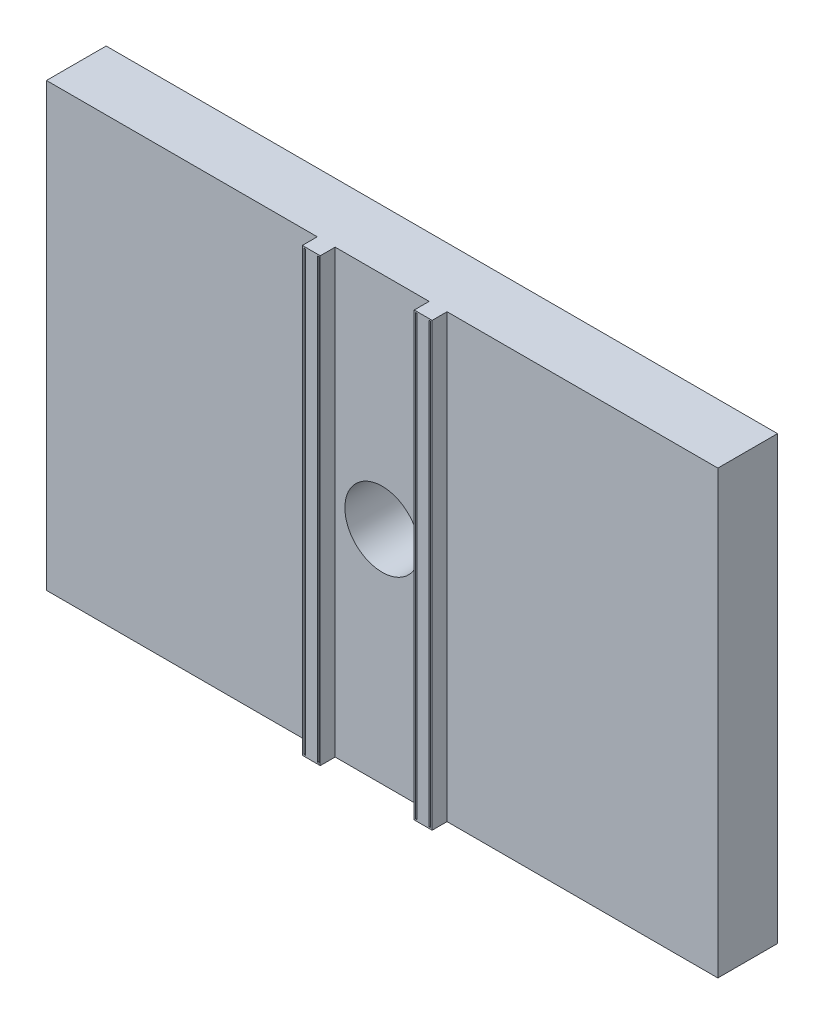
ISO-10303-21;
HEADER;
FILE_DESCRIPTION(('STEP AP214'),'2;1');
FILE_NAME('part.step','',(''),(''),'','','');
FILE_SCHEMA(('AUTOMOTIVE_DESIGN { 1 0 10303 214 1 1 1 1 }'));
ENDSEC;
DATA;
#1=APPLICATION_CONTEXT('core data for automotive mechanical design processes');
#2=APPLICATION_PROTOCOL_DEFINITION('international standard','automotive_design',2000,#1);
#3=PRODUCT_CONTEXT('',#1,'mechanical');
#4=PRODUCT('Part','Part','',(#3));
#5=PRODUCT_RELATED_PRODUCT_CATEGORY('part','',(#4));
#6=PRODUCT_DEFINITION_FORMATION('','',#4);
#7=PRODUCT_DEFINITION_CONTEXT('part definition',#1,'design');
#8=PRODUCT_DEFINITION('design','',#6,#7);
#9=PRODUCT_DEFINITION_SHAPE('','',#8);
#10=(LENGTH_UNIT() NAMED_UNIT(*) SI_UNIT(.MILLI.,.METRE.));
#11=(NAMED_UNIT(*) PLANE_ANGLE_UNIT() SI_UNIT($,.RADIAN.));
#12=(NAMED_UNIT(*) SI_UNIT($,.STERADIAN.) SOLID_ANGLE_UNIT());
#13=UNCERTAINTY_MEASURE_WITH_UNIT(LENGTH_MEASURE(1.E-05),#10,'distance_accuracy_value','');
#14=(GEOMETRIC_REPRESENTATION_CONTEXT(3) GLOBAL_UNCERTAINTY_ASSIGNED_CONTEXT((#13)) GLOBAL_UNIT_ASSIGNED_CONTEXT((#10,
#11,#12)) REPRESENTATION_CONTEXT('',''));
#15=CARTESIAN_POINT('',(0.,0.,0.));
#16=DIRECTION('',(0.,0.,1.));
#17=DIRECTION('',(1.,0.,0.));
#18=AXIS2_PLACEMENT_3D('',#15,#16,#17);
#19=CARTESIAN_POINT('',(0.,0.,10.16));
#20=DIRECTION('',(0.,0.,1.));
#21=DIRECTION('',(1.,0.,0.));
#22=AXIS2_PLACEMENT_3D('',#19,#20,#21);
#23=PLANE('',#22);
#24=DIRECTION('',(0.,1.,0.));
#25=VECTOR('',#24,1.);
#26=CARTESIAN_POINT('',(-36.35375,37.592,10.16));
#27=LINE('',#26,#25);
#28=CARTESIAN_POINT('',(-36.35375,-37.338,10.16));
#29=VERTEX_POINT('',#28);
#30=CARTESIAN_POINT('',(-36.35375,37.338,10.16));
#31=VERTEX_POINT('',#30);
#32=EDGE_CURVE('E361',#29,#31,#27,.T.);
#33=ORIENTED_EDGE('',*,*,#32,.T.);
#34=DIRECTION('',(1.,0.,0.));
#35=VECTOR('',#34,1.);
#36=CARTESIAN_POINT('',(-39.14775,37.338,10.16));
#37=LINE('',#36,#35);
#38=CARTESIAN_POINT('',(-36.60775,37.338,10.16));
#39=VERTEX_POINT('',#38);
#40=EDGE_CURVE('E324',#39,#31,#37,.T.);
#41=ORIENTED_EDGE('',*,*,#40,.F.);
#42=DIRECTION('',(0.,-1.,0.));
#43=VECTOR('',#42,1.);
#44=CARTESIAN_POINT('',(-36.60775,37.592,10.16));
#45=LINE('',#44,#43);
#46=CARTESIAN_POINT('',(-36.60775,-37.338,10.16));
#47=VERTEX_POINT('',#46);
#48=EDGE_CURVE('E339',#39,#47,#45,.T.);
#49=ORIENTED_EDGE('',*,*,#48,.T.);
#50=DIRECTION('',(1.,0.,0.));
#51=VECTOR('',#50,1.);
#52=CARTESIAN_POINT('',(-39.14775,-37.338,10.16));
#53=LINE('',#52,#51);
#54=EDGE_CURVE('E247',#47,#29,#53,.T.);
#55=ORIENTED_EDGE('',*,*,#54,.T.);
#56=EDGE_LOOP('',(#33,#41,#49,#55));
#57=FACE_BOUND('',#56,.T.);
#58=ADVANCED_FACE('F35',(#57),#23,.T.);
#59=DIRECTION('',(0.,1.,0.));
#60=VECTOR('',#59,1.);
#61=CARTESIAN_POINT('',(-38.63975,37.592,10.16));
#62=LINE('',#61,#60);
#63=CARTESIAN_POINT('',(-38.63975,-37.338,10.16));
#64=VERTEX_POINT('',#63);
#65=CARTESIAN_POINT('',(-38.63975,37.338,10.16));
#66=VERTEX_POINT('',#65);
#67=EDGE_CURVE('E233',#64,#66,#62,.T.);
#68=ORIENTED_EDGE('',*,*,#67,.T.);
#69=CARTESIAN_POINT('',(-38.89375,37.338,10.16));
#70=VERTEX_POINT('',#69);
#71=EDGE_CURVE('E50',#70,#66,#37,.T.);
#72=ORIENTED_EDGE('',*,*,#71,.F.);
#73=DIRECTION('',(0.,-1.,0.));
#74=VECTOR('',#73,1.);
#75=CARTESIAN_POINT('',(-38.89375,37.592,10.16));
#76=LINE('',#75,#74);
#77=CARTESIAN_POINT('',(-38.89375,-37.338,10.16));
#78=VERTEX_POINT('',#77);
#79=EDGE_CURVE('E343',#70,#78,#76,.T.);
#80=ORIENTED_EDGE('',*,*,#79,.T.);
#81=EDGE_CURVE('E255',#78,#64,#53,.T.);
#82=ORIENTED_EDGE('',*,*,#81,.T.);
#83=EDGE_LOOP('',(#68,#72,#80,#82));
#84=FACE_BOUND('',#83,.T.);
#85=ADVANCED_FACE('F525',(#84),#23,.T.);
#86=CARTESIAN_POINT('',(-36.35375,37.592,12.7));
#87=DIRECTION('',(-1.,0.,0.));
#88=DIRECTION('',(0.,-1.,0.));
#89=AXIS2_PLACEMENT_3D('',#86,#87,#88);
#90=PLANE('',#89);
#91=DIRECTION('',(0.,1.,0.));
#92=VECTOR('',#91,1.);
#93=CARTESIAN_POINT('',(-36.35375,37.592,12.7));
#94=LINE('',#93,#92);
#95=CARTESIAN_POINT('',(-36.35375,-37.338,12.7));
#96=VERTEX_POINT('',#95);
#97=CARTESIAN_POINT('',(-36.35375,37.338,12.7));
#98=VERTEX_POINT('',#97);
#99=EDGE_CURVE('E239',#96,#98,#94,.T.);
#100=ORIENTED_EDGE('',*,*,#99,.T.);
#101=DIRECTION('',(0.,0.,-1.));
#102=VECTOR('',#101,1.);
#103=CARTESIAN_POINT('',(-36.35375,37.338,12.7));
#104=LINE('',#103,#102);
#105=EDGE_CURVE('E332',#98,#31,#104,.T.);
#106=ORIENTED_EDGE('',*,*,#105,.T.);
#107=ORIENTED_EDGE('',*,*,#32,.F.);
#108=DIRECTION('',(0.,0.,-1.));
#109=VECTOR('',#108,1.);
#110=CARTESIAN_POINT('',(-36.35375,-37.338,12.7));
#111=LINE('',#110,#109);
#112=EDGE_CURVE('E252',#96,#29,#111,.T.);
#113=ORIENTED_EDGE('',*,*,#112,.F.);
#114=EDGE_LOOP('',(#100,#106,#107,#113));
#115=FACE_BOUND('',#114,.T.);
#116=ADVANCED_FACE('F531',(#115),#90,.T.);
#117=CARTESIAN_POINT('',(-38.89375,37.592,12.7));
#118=DIRECTION('',(1.,0.,0.));
#119=DIRECTION('',(0.,1.,0.));
#120=AXIS2_PLACEMENT_3D('',#117,#118,#119);
#121=PLANE('',#120);
#122=ORIENTED_EDGE('',*,*,#79,.F.);
#123=DIRECTION('',(0.,0.,1.));
#124=VECTOR('',#123,1.);
#125=CARTESIAN_POINT('',(-38.89375,37.338,12.7));
#126=LINE('',#125,#124);
#127=CARTESIAN_POINT('',(-38.89375,37.338,12.7));
#128=VERTEX_POINT('',#127);
#129=EDGE_CURVE('E57',#70,#128,#126,.T.);
#130=ORIENTED_EDGE('',*,*,#129,.T.);
#131=DIRECTION('',(0.,-1.,0.));
#132=VECTOR('',#131,1.);
#133=CARTESIAN_POINT('',(-38.89375,37.592,12.7));
#134=LINE('',#133,#132);
#135=CARTESIAN_POINT('',(-38.89375,-37.338,12.7));
#136=VERTEX_POINT('',#135);
#137=EDGE_CURVE('E346',#128,#136,#134,.T.);
#138=ORIENTED_EDGE('',*,*,#137,.T.);
#139=DIRECTION('',(0.,0.,1.));
#140=VECTOR('',#139,1.);
#141=CARTESIAN_POINT('',(-38.89375,-37.338,12.7));
#142=LINE('',#141,#140);
#143=EDGE_CURVE('E248',#78,#136,#142,.T.);
#144=ORIENTED_EDGE('',*,*,#143,.F.);
#145=EDGE_LOOP('',(#122,#130,#138,#144));
#146=FACE_BOUND('',#145,.T.);
#147=ADVANCED_FACE('F617',(#146),#121,.T.);
#148=CARTESIAN_POINT('',(-36.60775,37.592,12.7));
#149=DIRECTION('',(1.,0.,0.));
#150=DIRECTION('',(0.,1.,0.));
#151=AXIS2_PLACEMENT_3D('',#148,#149,#150);
#152=PLANE('',#151);
#153=ORIENTED_EDGE('',*,*,#48,.F.);
#154=DIRECTION('',(0.,0.,1.));
#155=VECTOR('',#154,1.);
#156=CARTESIAN_POINT('',(-36.60775,37.338,12.7));
#157=LINE('',#156,#155);
#158=CARTESIAN_POINT('',(-36.60775,37.338,12.7));
#159=VERTEX_POINT('',#158);
#160=EDGE_CURVE('E229',#39,#159,#157,.T.);
#161=ORIENTED_EDGE('',*,*,#160,.T.);
#162=DIRECTION('',(0.,-1.,0.));
#163=VECTOR('',#162,1.);
#164=CARTESIAN_POINT('',(-36.60775,37.592,12.7));
#165=LINE('',#164,#163);
#166=CARTESIAN_POINT('',(-36.60775,-37.338,12.7));
#167=VERTEX_POINT('',#166);
#168=EDGE_CURVE('E222',#159,#167,#165,.T.);
#169=ORIENTED_EDGE('',*,*,#168,.T.);
#170=DIRECTION('',(0.,0.,1.));
#171=VECTOR('',#170,1.);
#172=CARTESIAN_POINT('',(-36.60775,-37.338,12.7));
#173=LINE('',#172,#171);
#174=EDGE_CURVE('E227',#47,#167,#173,.T.);
#175=ORIENTED_EDGE('',*,*,#174,.F.);
#176=EDGE_LOOP('',(#153,#161,#169,#175));
#177=FACE_BOUND('',#176,.T.);
#178=ADVANCED_FACE('F225',(#177),#152,.T.);
#179=CARTESIAN_POINT('',(-38.63975,37.592,12.7));
#180=DIRECTION('',(-1.,0.,0.));
#181=DIRECTION('',(0.,-1.,0.));
#182=AXIS2_PLACEMENT_3D('',#179,#180,#181);
#183=PLANE('',#182);
#184=DIRECTION('',(0.,1.,0.));
#185=VECTOR('',#184,1.);
#186=CARTESIAN_POINT('',(-38.63975,37.592,12.7));
#187=LINE('',#186,#185);
#188=CARTESIAN_POINT('',(-38.63975,-37.338,12.7));
#189=VERTEX_POINT('',#188);
#190=CARTESIAN_POINT('',(-38.63975,37.338,12.7));
#191=VERTEX_POINT('',#190);
#192=EDGE_CURVE('E232',#189,#191,#187,.T.);
#193=ORIENTED_EDGE('',*,*,#192,.T.);
#194=DIRECTION('',(0.,0.,-1.));
#195=VECTOR('',#194,1.);
#196=CARTESIAN_POINT('',(-38.63975,37.338,12.7));
#197=LINE('',#196,#195);
#198=EDGE_CURVE('E328',#191,#66,#197,.T.);
#199=ORIENTED_EDGE('',*,*,#198,.T.);
#200=ORIENTED_EDGE('',*,*,#67,.F.);
#201=DIRECTION('',(0.,0.,-1.));
#202=VECTOR('',#201,1.);
#203=CARTESIAN_POINT('',(-38.63975,-37.338,12.7));
#204=LINE('',#203,#202);
#205=EDGE_CURVE('E249',#189,#64,#204,.T.);
#206=ORIENTED_EDGE('',*,*,#205,.F.);
#207=EDGE_LOOP('',(#193,#199,#200,#206));
#208=FACE_BOUND('',#207,.T.);
#209=ADVANCED_FACE('F611',(#208),#183,.T.);
#210=DIRECTION('',(0.,-1.,0.));
#211=VECTOR('',#210,1.);
#212=CARTESIAN_POINT('',(-36.09975,37.592,10.16));
#213=LINE('',#212,#211);
#214=CARTESIAN_POINT('',(-36.09975,37.592,10.16));
#215=VERTEX_POINT('',#214);
#216=CARTESIAN_POINT('',(-36.09975,-37.592,10.16));
#217=VERTEX_POINT('',#216);
#218=EDGE_CURVE('E357',#215,#217,#213,.T.);
#219=ORIENTED_EDGE('',*,*,#218,.T.);
#220=DIRECTION('',(-1.,0.,0.));
#221=VECTOR('',#220,1.);
#222=CARTESIAN_POINT('',(-28.09875,-37.592,10.16));
#223=LINE('',#222,#221);
#224=CARTESIAN_POINT('',(-20.09775,-37.592,10.16));
#225=VERTEX_POINT('',#224);
#226=EDGE_CURVE('E317',#225,#217,#223,.T.);
#227=ORIENTED_EDGE('',*,*,#226,.F.);
#228=DIRECTION('',(0.,-1.,0.));
#229=VECTOR('',#228,1.);
#230=CARTESIAN_POINT('',(-20.09775,37.592,10.16));
#231=LINE('',#230,#229);
#232=CARTESIAN_POINT('',(-20.09775,37.592,10.16));
#233=VERTEX_POINT('',#232);
#234=EDGE_CURVE('E429',#233,#225,#231,.T.);
#235=ORIENTED_EDGE('',*,*,#234,.F.);
#236=DIRECTION('',(-1.,0.,0.));
#237=VECTOR('',#236,1.);
#238=CARTESIAN_POINT('',(-28.09875,37.592,10.16));
#239=LINE('',#238,#237);
#240=EDGE_CURVE('E452',#233,#215,#239,.T.);
#241=ORIENTED_EDGE('',*,*,#240,.T.);
#242=EDGE_LOOP('',(#219,#227,#235,#241));
#243=FACE_BOUND('',#242,.T.);
#244=CARTESIAN_POINT('',(-28.09875,0.,10.16));
#245=DIRECTION('',(0.,0.,1.));
#246=DIRECTION('',(1.,0.,0.));
#247=AXIS2_PLACEMENT_3D('',#244,#245,#246);
#248=CIRCLE('',#247,6.35);
#249=CARTESIAN_POINT('',(-21.74875,0.,10.16));
#250=VERTEX_POINT('',#249);
#251=EDGE_CURVE('E402',#250,#250,#248,.T.);
#252=ORIENTED_EDGE('',*,*,#251,.F.);
#253=EDGE_LOOP('',(#252));
#254=FACE_BOUND('',#253,.T.);
#255=ADVANCED_FACE('F483',(#243,#254),#23,.T.);
#256=CARTESIAN_POINT('',(0.,0.,0.));
#257=DIRECTION('',(0.,0.,1.));
#258=DIRECTION('',(1.,0.,0.));
#259=AXIS2_PLACEMENT_3D('',#256,#257,#258);
#260=PLANE('',#259);
#261=DIRECTION('',(-1.,0.,0.));
#262=VECTOR('',#261,1.);
#263=CARTESIAN_POINT('',(-28.09875,-37.592,0.));
#264=LINE('',#263,#262);
#265=CARTESIAN_POINT('',(29.05125,-37.592,0.));
#266=VERTEX_POINT('',#265);
#267=CARTESIAN_POINT('',(-85.24875,-37.592,0.));
#268=VERTEX_POINT('',#267);
#269=EDGE_CURVE('E312',#266,#268,#264,.T.);
#270=ORIENTED_EDGE('',*,*,#269,.T.);
#271=DIRECTION('',(0.,1.,0.));
#272=VECTOR('',#271,1.);
#273=CARTESIAN_POINT('',(-85.24875,37.592,0.));
#274=LINE('',#273,#272);
#275=CARTESIAN_POINT('',(-85.24875,37.592,0.));
#276=VERTEX_POINT('',#275);
#277=EDGE_CURVE('E370',#268,#276,#274,.T.);
#278=ORIENTED_EDGE('',*,*,#277,.T.);
#279=DIRECTION('',(-1.,0.,0.));
#280=VECTOR('',#279,1.);
#281=CARTESIAN_POINT('',(-28.09875,37.592,0.));
#282=LINE('',#281,#280);
#283=CARTESIAN_POINT('',(29.05125,37.592,0.));
#284=VERTEX_POINT('',#283);
#285=EDGE_CURVE('E448',#284,#276,#282,.T.);
#286=ORIENTED_EDGE('',*,*,#285,.F.);
#287=DIRECTION('',(0.,1.,0.));
#288=VECTOR('',#287,1.);
#289=CARTESIAN_POINT('',(29.05125,37.592,0.));
#290=LINE('',#289,#288);
#291=EDGE_CURVE('E444',#266,#284,#290,.T.);
#292=ORIENTED_EDGE('',*,*,#291,.F.);
#293=EDGE_LOOP('',(#270,#278,#286,#292));
#294=FACE_BOUND('',#293,.T.);
#295=CARTESIAN_POINT('',(-44.1930680412579,16.0943180412579,0.));
#296=DIRECTION('',(0.,0.,1.));
#297=DIRECTION('',(1.,0.,0.));
#298=AXIS2_PLACEMENT_3D('',#295,#296,#297);
#299=CIRCLE('',#298,2.032);
#300=CARTESIAN_POINT('',(-42.1610680412579,16.0943180412579,0.));
#301=VERTEX_POINT('',#300);
#302=EDGE_CURVE('E335',#301,#301,#299,.T.);
#303=ORIENTED_EDGE('',*,*,#302,.T.);
#304=EDGE_LOOP('',(#303));
#305=FACE_BOUND('',#304,.T.);
#306=CARTESIAN_POINT('',(-12.0044319587421,16.0943180412579,0.));
#307=DIRECTION('',(0.,0.,-1.));
#308=DIRECTION('',(-1.,0.,0.));
#309=AXIS2_PLACEMENT_3D('',#306,#307,#308);
#310=CIRCLE('',#309,2.032);
#311=CARTESIAN_POINT('',(-14.0364319587421,16.0943180412579,0.));
#312=VERTEX_POINT('',#311);
#313=EDGE_CURVE('E398',#312,#312,#310,.T.);
#314=ORIENTED_EDGE('',*,*,#313,.F.);
#315=EDGE_LOOP('',(#314));
#316=FACE_BOUND('',#315,.T.);
#317=CARTESIAN_POINT('',(-28.09875,0.,0.));
#318=DIRECTION('',(0.,0.,1.));
#319=DIRECTION('',(1.,0.,0.));
#320=AXIS2_PLACEMENT_3D('',#317,#318,#319);
#321=CIRCLE('',#320,6.35);
#322=CARTESIAN_POINT('',(-21.74875,0.,0.));
#323=VERTEX_POINT('',#322);
#324=EDGE_CURVE('E11',#323,#323,#321,.T.);
#325=ORIENTED_EDGE('',*,*,#324,.T.);
#326=EDGE_LOOP('',(#325));
#327=FACE_BOUND('',#326,.T.);
#328=CARTESIAN_POINT('',(-44.1930680412579,-16.0943180412579,0.));
#329=DIRECTION('',(0.,0.,-1.));
#330=DIRECTION('',(1.,0.,0.));
#331=AXIS2_PLACEMENT_3D('',#328,#329,#330);
#332=CIRCLE('',#331,2.032);
#333=CARTESIAN_POINT('',(-42.1610680412579,-16.0943180412579,0.));
#334=VERTEX_POINT('',#333);
#335=EDGE_CURVE('E259',#334,#334,#332,.T.);
#336=ORIENTED_EDGE('',*,*,#335,.F.);
#337=EDGE_LOOP('',(#336));
#338=FACE_BOUND('',#337,.T.);
#339=CARTESIAN_POINT('',(-12.0044319587421,-16.0943180412579,0.));
#340=DIRECTION('',(0.,0.,1.));
#341=DIRECTION('',(-1.,0.,0.));
#342=AXIS2_PLACEMENT_3D('',#339,#340,#341);
#343=CIRCLE('',#342,2.032);
#344=CARTESIAN_POINT('',(-14.0364319587421,-16.0943180412579,0.));
#345=VERTEX_POINT('',#344);
#346=EDGE_CURVE('E297',#345,#345,#343,.T.);
#347=ORIENTED_EDGE('',*,*,#346,.T.);
#348=EDGE_LOOP('',(#347));
#349=FACE_BOUND('',#348,.T.);
#350=ADVANCED_FACE('F464',(#294,#305,#316,#327,#338,#349),#260,.F.);
#351=DIRECTION('',(-1.,0.,0.));
#352=VECTOR('',#351,1.);
#353=CARTESIAN_POINT('',(-17.04975,37.338,10.16));
#354=LINE('',#353,#352);
#355=CARTESIAN_POINT('',(-19.58975,37.338,10.16));
#356=VERTEX_POINT('',#355);
#357=CARTESIAN_POINT('',(-19.84375,37.338,10.16));
#358=VERTEX_POINT('',#357);
#359=EDGE_CURVE('E379',#356,#358,#354,.T.);
#360=ORIENTED_EDGE('',*,*,#359,.T.);
#361=DIRECTION('',(0.,1.,0.));
#362=VECTOR('',#361,1.);
#363=CARTESIAN_POINT('',(-19.84375,37.592,10.16));
#364=LINE('',#363,#362);
#365=CARTESIAN_POINT('',(-19.84375,-37.338,10.16));
#366=VERTEX_POINT('',#365);
#367=EDGE_CURVE('E433',#366,#358,#364,.T.);
#368=ORIENTED_EDGE('',*,*,#367,.F.);
#369=DIRECTION('',(-1.,0.,0.));
#370=VECTOR('',#369,1.);
#371=CARTESIAN_POINT('',(-17.04975,-37.338,10.16));
#372=LINE('',#371,#370);
#373=CARTESIAN_POINT('',(-19.58975,-37.338,10.16));
#374=VERTEX_POINT('',#373);
#375=EDGE_CURVE('E277',#374,#366,#372,.T.);
#376=ORIENTED_EDGE('',*,*,#375,.F.);
#377=DIRECTION('',(0.,-1.,0.));
#378=VECTOR('',#377,1.);
#379=CARTESIAN_POINT('',(-19.58975,37.592,10.16));
#380=LINE('',#379,#378);
#381=EDGE_CURVE('E407',#356,#374,#380,.T.);
#382=ORIENTED_EDGE('',*,*,#381,.F.);
#383=EDGE_LOOP('',(#360,#368,#376,#382));
#384=FACE_BOUND('',#383,.T.);
#385=ADVANCED_FACE('F540',(#384),#23,.T.);
#386=CARTESIAN_POINT('',(-17.30375,37.338,10.16));
#387=VERTEX_POINT('',#386);
#388=CARTESIAN_POINT('',(-17.55775,37.338,10.16));
#389=VERTEX_POINT('',#388);
#390=EDGE_CURVE('E383',#387,#389,#354,.T.);
#391=ORIENTED_EDGE('',*,*,#390,.T.);
#392=DIRECTION('',(0.,1.,0.));
#393=VECTOR('',#392,1.);
#394=CARTESIAN_POINT('',(-17.55775,37.592,10.16));
#395=LINE('',#394,#393);
#396=CARTESIAN_POINT('',(-17.55775,-37.338,10.16));
#397=VERTEX_POINT('',#396);
#398=EDGE_CURVE('E411',#397,#389,#395,.T.);
#399=ORIENTED_EDGE('',*,*,#398,.F.);
#400=CARTESIAN_POINT('',(-17.30375,-37.338,10.16));
#401=VERTEX_POINT('',#400);
#402=EDGE_CURVE('E282',#401,#397,#372,.T.);
#403=ORIENTED_EDGE('',*,*,#402,.F.);
#404=DIRECTION('',(0.,-1.,0.));
#405=VECTOR('',#404,1.);
#406=CARTESIAN_POINT('',(-17.30375,37.592,10.16));
#407=LINE('',#406,#405);
#408=EDGE_CURVE('E422',#387,#401,#407,.T.);
#409=ORIENTED_EDGE('',*,*,#408,.F.);
#410=EDGE_LOOP('',(#391,#399,#403,#409));
#411=FACE_BOUND('',#410,.T.);
#412=ADVANCED_FACE('F535',(#411),#23,.T.);
#413=CARTESIAN_POINT('',(29.05125,37.592,10.16));
#414=VERTEX_POINT('',#413);
#415=CARTESIAN_POINT('',(-17.04975,37.592,10.16));
#416=VERTEX_POINT('',#415);
#417=EDGE_CURVE('E449',#414,#416,#239,.T.);
#418=ORIENTED_EDGE('',*,*,#417,.T.);
#419=DIRECTION('',(0.,1.,0.));
#420=VECTOR('',#419,1.);
#421=CARTESIAN_POINT('',(-17.04975,37.592,10.16));
#422=LINE('',#421,#420);
#423=CARTESIAN_POINT('',(-17.04975,-37.592,10.16));
#424=VERTEX_POINT('',#423);
#425=EDGE_CURVE('E414',#424,#416,#422,.T.);
#426=ORIENTED_EDGE('',*,*,#425,.F.);
#427=CARTESIAN_POINT('',(29.05125,-37.592,10.16));
#428=VERTEX_POINT('',#427);
#429=EDGE_CURVE('E313',#428,#424,#223,.T.);
#430=ORIENTED_EDGE('',*,*,#429,.F.);
#431=DIRECTION('',(0.,1.,0.));
#432=VECTOR('',#431,1.);
#433=CARTESIAN_POINT('',(29.05125,37.592,10.16));
#434=LINE('',#433,#432);
#435=EDGE_CURVE('E445',#428,#414,#434,.T.);
#436=ORIENTED_EDGE('',*,*,#435,.T.);
#437=EDGE_LOOP('',(#418,#426,#430,#436));
#438=FACE_BOUND('',#437,.T.);
#439=ADVANCED_FACE('F509',(#438),#23,.T.);
#440=DIRECTION('',(0.,1.,0.));
#441=VECTOR('',#440,1.);
#442=CARTESIAN_POINT('',(-39.14775,37.592,10.16));
#443=LINE('',#442,#441);
#444=CARTESIAN_POINT('',(-39.14775,-37.592,10.16));
#445=VERTEX_POINT('',#444);
#446=CARTESIAN_POINT('',(-39.14775,37.592,10.16));
#447=VERTEX_POINT('',#446);
#448=EDGE_CURVE('E349',#445,#447,#443,.T.);
#449=ORIENTED_EDGE('',*,*,#448,.T.);
#450=CARTESIAN_POINT('',(-85.24875,37.592,10.16));
#451=VERTEX_POINT('',#450);
#452=EDGE_CURVE('E447',#447,#451,#239,.T.);
#453=ORIENTED_EDGE('',*,*,#452,.T.);
#454=DIRECTION('',(0.,1.,0.));
#455=VECTOR('',#454,1.);
#456=CARTESIAN_POINT('',(-85.24875,37.592,10.16));
#457=LINE('',#456,#455);
#458=CARTESIAN_POINT('',(-85.24875,-37.592,10.16));
#459=VERTEX_POINT('',#458);
#460=EDGE_CURVE('E371',#459,#451,#457,.T.);
#461=ORIENTED_EDGE('',*,*,#460,.F.);
#462=EDGE_CURVE('E318',#445,#459,#223,.T.);
#463=ORIENTED_EDGE('',*,*,#462,.F.);
#464=EDGE_LOOP('',(#449,#453,#461,#463));
#465=FACE_BOUND('',#464,.T.);
#466=ADVANCED_FACE('F496',(#465),#23,.T.);
#467=CARTESIAN_POINT('',(29.05125,37.592,10.16));
#468=DIRECTION('',(-1.,0.,0.));
#469=DIRECTION('',(0.,-1.,0.));
#470=AXIS2_PLACEMENT_3D('',#467,#468,#469);
#471=PLANE('',#470);
#472=ORIENTED_EDGE('',*,*,#291,.T.);
#473=DIRECTION('',(0.,0.,-1.));
#474=VECTOR('',#473,1.);
#475=CARTESIAN_POINT('',(29.05125,37.592,10.16));
#476=LINE('',#475,#474);
#477=EDGE_CURVE('E43',#414,#284,#476,.T.);
#478=ORIENTED_EDGE('',*,*,#477,.F.);
#479=ORIENTED_EDGE('',*,*,#435,.F.);
#480=DIRECTION('',(0.,0.,-1.));
#481=VECTOR('',#480,1.);
#482=CARTESIAN_POINT('',(29.05125,-37.592,10.16));
#483=LINE('',#482,#481);
#484=EDGE_CURVE('E316',#428,#266,#483,.T.);
#485=ORIENTED_EDGE('',*,*,#484,.T.);
#486=EDGE_LOOP('',(#472,#478,#479,#485));
#487=FACE_BOUND('',#486,.T.);
#488=ADVANCED_FACE('F37',(#487),#471,.F.);
#489=CARTESIAN_POINT('',(-28.09875,37.592,10.16));
#490=DIRECTION('',(0.,-1.,0.));
#491=DIRECTION('',(0.,0.,-1.));
#492=AXIS2_PLACEMENT_3D('',#489,#490,#491);
#493=PLANE('',#492);
#494=DIRECTION('',(0.,0.,-1.));
#495=VECTOR('',#494,1.);
#496=CARTESIAN_POINT('',(-39.14775,37.592,12.7));
#497=LINE('',#496,#495);
#498=CARTESIAN_POINT('',(-39.14775,37.592,12.7));
#499=VERTEX_POINT('',#498);
#500=EDGE_CURVE('E352',#499,#447,#497,.T.);
#501=ORIENTED_EDGE('',*,*,#500,.F.);
#502=DIRECTION('',(1.,0.,0.));
#503=VECTOR('',#502,1.);
#504=CARTESIAN_POINT('',(-36.09975,37.592,12.7));
#505=LINE('',#504,#503);
#506=CARTESIAN_POINT('',(-36.09975,37.592,12.7));
#507=VERTEX_POINT('',#506);
#508=EDGE_CURVE('E360',#499,#507,#505,.T.);
#509=ORIENTED_EDGE('',*,*,#508,.T.);
#510=DIRECTION('',(0.,0.,-1.));
#511=VECTOR('',#510,1.);
#512=CARTESIAN_POINT('',(-36.09975,37.592,12.7));
#513=LINE('',#512,#511);
#514=EDGE_CURVE('E365',#507,#215,#513,.T.);
#515=ORIENTED_EDGE('',*,*,#514,.T.);
#516=ORIENTED_EDGE('',*,*,#240,.F.);
#517=DIRECTION('',(0.,0.,-1.));
#518=VECTOR('',#517,1.);
#519=CARTESIAN_POINT('',(-20.09775,37.592,12.7));
#520=LINE('',#519,#518);
#521=CARTESIAN_POINT('',(-20.09775,37.592,12.7));
#522=VERTEX_POINT('',#521);
#523=EDGE_CURVE('E438',#522,#233,#520,.T.);
#524=ORIENTED_EDGE('',*,*,#523,.F.);
#525=DIRECTION('',(-1.,0.,0.));
#526=VECTOR('',#525,1.);
#527=CARTESIAN_POINT('',(-20.09775,37.592,12.7));
#528=LINE('',#527,#526);
#529=CARTESIAN_POINT('',(-17.04975,37.592,12.7));
#530=VERTEX_POINT('',#529);
#531=EDGE_CURVE('E436',#530,#522,#528,.T.);
#532=ORIENTED_EDGE('',*,*,#531,.F.);
#533=DIRECTION('',(0.,0.,-1.));
#534=VECTOR('',#533,1.);
#535=CARTESIAN_POINT('',(-17.04975,37.592,12.7));
#536=LINE('',#535,#534);
#537=EDGE_CURVE('E424',#530,#416,#536,.T.);
#538=ORIENTED_EDGE('',*,*,#537,.T.);
#539=ORIENTED_EDGE('',*,*,#417,.F.);
#540=ORIENTED_EDGE('',*,*,#477,.T.);
#541=ORIENTED_EDGE('',*,*,#285,.T.);
#542=DIRECTION('',(0.,0.,-1.));
#543=VECTOR('',#542,1.);
#544=CARTESIAN_POINT('',(-85.24875,37.592,10.16));
#545=LINE('',#544,#543);
#546=EDGE_CURVE('E374',#451,#276,#545,.T.);
#547=ORIENTED_EDGE('',*,*,#546,.F.);
#548=ORIENTED_EDGE('',*,*,#452,.F.);
#549=EDGE_LOOP('',(#501,#509,#515,#516,#524,#532,#538,#539,#540,#541,#547,#548));
#550=FACE_BOUND('',#549,.T.);
#551=ADVANCED_FACE('F460',(#550),#493,.F.);
#552=CARTESIAN_POINT('',(-20.09775,37.592,12.7));
#553=DIRECTION('',(1.,0.,0.));
#554=DIRECTION('',(0.,0.,-1.));
#555=AXIS2_PLACEMENT_3D('',#552,#553,#554);
#556=PLANE('',#555);
#557=ORIENTED_EDGE('',*,*,#234,.T.);
#558=DIRECTION('',(0.,0.,-1.));
#559=VECTOR('',#558,1.);
#560=CARTESIAN_POINT('',(-20.09775,-37.592,12.7));
#561=LINE('',#560,#559);
#562=CARTESIAN_POINT('',(-20.09775,-37.592,12.7));
#563=VERTEX_POINT('',#562);
#564=EDGE_CURVE('E309',#563,#225,#561,.T.);
#565=ORIENTED_EDGE('',*,*,#564,.F.);
#566=DIRECTION('',(0.,-1.,0.));
#567=VECTOR('',#566,1.);
#568=CARTESIAN_POINT('',(-20.09775,37.592,12.7));
#569=LINE('',#568,#567);
#570=EDGE_CURVE('E430',#522,#563,#569,.T.);
#571=ORIENTED_EDGE('',*,*,#570,.F.);
#572=ORIENTED_EDGE('',*,*,#523,.T.);
#573=EDGE_LOOP('',(#557,#565,#571,#572));
#574=FACE_BOUND('',#573,.T.);
#575=ADVANCED_FACE('F500',(#574),#556,.F.);
#576=CARTESIAN_POINT('',(-19.84375,37.592,12.7));
#577=DIRECTION('',(-1.,0.,0.));
#578=DIRECTION('',(0.,-1.,0.));
#579=AXIS2_PLACEMENT_3D('',#576,#577,#578);
#580=PLANE('',#579);
#581=ORIENTED_EDGE('',*,*,#367,.T.);
#582=DIRECTION('',(0.,0.,1.));
#583=VECTOR('',#582,1.);
#584=CARTESIAN_POINT('',(-19.84375,37.338,12.7));
#585=LINE('',#584,#583);
#586=CARTESIAN_POINT('',(-19.84375,37.338,12.7));
#587=VERTEX_POINT('',#586);
#588=EDGE_CURVE('E395',#358,#587,#585,.T.);
#589=ORIENTED_EDGE('',*,*,#588,.T.);
#590=DIRECTION('',(0.,1.,0.));
#591=VECTOR('',#590,1.);
#592=CARTESIAN_POINT('',(-19.84375,37.592,12.7));
#593=LINE('',#592,#591);
#594=CARTESIAN_POINT('',(-19.84375,-37.338,12.7));
#595=VERTEX_POINT('',#594);
#596=EDGE_CURVE('E432',#595,#587,#593,.T.);
#597=ORIENTED_EDGE('',*,*,#596,.F.);
#598=DIRECTION('',(0.,0.,1.));
#599=VECTOR('',#598,1.);
#600=CARTESIAN_POINT('',(-19.84375,-37.338,12.7));
#601=LINE('',#600,#599);
#602=EDGE_CURVE('E294',#366,#595,#601,.T.);
#603=ORIENTED_EDGE('',*,*,#602,.F.);
#604=EDGE_LOOP('',(#581,#589,#597,#603));
#605=FACE_BOUND('',#604,.T.);
#606=ADVANCED_FACE('F522',(#605),#580,.F.);
#607=CARTESIAN_POINT('',(0.,0.,12.7));
#608=DIRECTION('',(0.,0.,-1.));
#609=DIRECTION('',(-1.,0.,0.));
#610=AXIS2_PLACEMENT_3D('',#607,#608,#609);
#611=PLANE('',#610);
#612=DIRECTION('',(-1.,0.,0.));
#613=VECTOR('',#612,1.);
#614=CARTESIAN_POINT('',(-20.09775,-37.592,12.7));
#615=LINE('',#614,#613);
#616=CARTESIAN_POINT('',(-17.04975,-37.592,12.7));
#617=VERTEX_POINT('',#616);
#618=EDGE_CURVE('E306',#617,#563,#615,.T.);
#619=ORIENTED_EDGE('',*,*,#618,.F.);
#620=DIRECTION('',(0.,1.,0.));
#621=VECTOR('',#620,1.);
#622=CARTESIAN_POINT('',(-17.04975,37.592,12.7));
#623=LINE('',#622,#621);
#624=EDGE_CURVE('E418',#617,#530,#623,.T.);
#625=ORIENTED_EDGE('',*,*,#624,.T.);
#626=ORIENTED_EDGE('',*,*,#531,.T.);
#627=ORIENTED_EDGE('',*,*,#570,.T.);
#628=EDGE_LOOP('',(#619,#625,#626,#627));
#629=FACE_BOUND('',#628,.T.);
#630=DIRECTION('',(-1.,0.,0.));
#631=VECTOR('',#630,1.);
#632=CARTESIAN_POINT('',(-17.04975,-37.338,12.7));
#633=LINE('',#632,#631);
#634=CARTESIAN_POINT('',(-17.30375,-37.338,12.7));
#635=VERTEX_POINT('',#634);
#636=CARTESIAN_POINT('',(-17.55775,-37.338,12.7));
#637=VERTEX_POINT('',#636);
#638=EDGE_CURVE('E281',#635,#637,#633,.T.);
#639=ORIENTED_EDGE('',*,*,#638,.T.);
#640=DIRECTION('',(0.,1.,0.));
#641=VECTOR('',#640,1.);
#642=CARTESIAN_POINT('',(-17.55775,37.592,12.7));
#643=LINE('',#642,#641);
#644=CARTESIAN_POINT('',(-17.55775,37.338,12.7));
#645=VERTEX_POINT('',#644);
#646=EDGE_CURVE('E410',#637,#645,#643,.T.);
#647=ORIENTED_EDGE('',*,*,#646,.T.);
#648=DIRECTION('',(-1.,0.,0.));
#649=VECTOR('',#648,1.);
#650=CARTESIAN_POINT('',(-17.04975,37.338,12.7));
#651=LINE('',#650,#649);
#652=CARTESIAN_POINT('',(-17.30375,37.338,12.7));
#653=VERTEX_POINT('',#652);
#654=EDGE_CURVE('E382',#653,#645,#651,.T.);
#655=ORIENTED_EDGE('',*,*,#654,.F.);
#656=DIRECTION('',(0.,-1.,0.));
#657=VECTOR('',#656,1.);
#658=CARTESIAN_POINT('',(-17.30375,37.592,12.7));
#659=LINE('',#658,#657);
#660=EDGE_CURVE('E421',#653,#635,#659,.T.);
#661=ORIENTED_EDGE('',*,*,#660,.T.);
#662=EDGE_LOOP('',(#639,#647,#655,#661));
#663=FACE_BOUND('',#662,.T.);
#664=ORIENTED_EDGE('',*,*,#596,.T.);
#665=CARTESIAN_POINT('',(-19.58975,37.338,12.7));
#666=VERTEX_POINT('',#665);
#667=EDGE_CURVE('E380',#666,#587,#651,.T.);
#668=ORIENTED_EDGE('',*,*,#667,.F.);
#669=DIRECTION('',(0.,-1.,0.));
#670=VECTOR('',#669,1.);
#671=CARTESIAN_POINT('',(-19.58975,37.592,12.7));
#672=LINE('',#671,#670);
#673=CARTESIAN_POINT('',(-19.58975,-37.338,12.7));
#674=VERTEX_POINT('',#673);
#675=EDGE_CURVE('E408',#666,#674,#672,.T.);
#676=ORIENTED_EDGE('',*,*,#675,.T.);
#677=EDGE_CURVE('E278',#674,#595,#633,.T.);
#678=ORIENTED_EDGE('',*,*,#677,.T.);
#679=EDGE_LOOP('',(#664,#668,#676,#678));
#680=FACE_BOUND('',#679,.T.);
#681=ADVANCED_FACE('F503',(#629,#663,#680),#611,.F.);
#682=CARTESIAN_POINT('',(-17.04975,37.592,12.7));
#683=DIRECTION('',(-1.,0.,0.));
#684=DIRECTION('',(0.,0.,1.));
#685=AXIS2_PLACEMENT_3D('',#682,#683,#684);
#686=PLANE('',#685);
#687=ORIENTED_EDGE('',*,*,#425,.T.);
#688=ORIENTED_EDGE('',*,*,#537,.F.);
#689=ORIENTED_EDGE('',*,*,#624,.F.);
#690=DIRECTION('',(0.,0.,-1.));
#691=VECTOR('',#690,1.);
#692=CARTESIAN_POINT('',(-17.04975,-37.592,12.7));
#693=LINE('',#692,#691);
#694=EDGE_CURVE('E301',#617,#424,#693,.T.);
#695=ORIENTED_EDGE('',*,*,#694,.T.);
#696=EDGE_LOOP('',(#687,#688,#689,#695));
#697=FACE_BOUND('',#696,.T.);
#698=ADVANCED_FACE('F511',(#697),#686,.F.);
#699=CARTESIAN_POINT('',(-17.30375,37.592,12.7));
#700=DIRECTION('',(1.,0.,0.));
#701=DIRECTION('',(0.,1.,0.));
#702=AXIS2_PLACEMENT_3D('',#699,#700,#701);
#703=PLANE('',#702);
#704=ORIENTED_EDGE('',*,*,#660,.F.);
#705=DIRECTION('',(0.,0.,-1.));
#706=VECTOR('',#705,1.);
#707=CARTESIAN_POINT('',(-17.30375,37.338,12.7));
#708=LINE('',#707,#706);
#709=EDGE_CURVE('E392',#653,#387,#708,.T.);
#710=ORIENTED_EDGE('',*,*,#709,.T.);
#711=ORIENTED_EDGE('',*,*,#408,.T.);
#712=DIRECTION('',(0.,0.,-1.));
#713=VECTOR('',#712,1.);
#714=CARTESIAN_POINT('',(-17.30375,-37.338,12.7));
#715=LINE('',#714,#713);
#716=EDGE_CURVE('E291',#635,#401,#715,.T.);
#717=ORIENTED_EDGE('',*,*,#716,.F.);
#718=EDGE_LOOP('',(#704,#710,#711,#717));
#719=FACE_BOUND('',#718,.T.);
#720=ADVANCED_FACE('F513',(#719),#703,.F.);
#721=CARTESIAN_POINT('',(-19.58975,37.592,12.7));
#722=DIRECTION('',(1.,0.,0.));
#723=DIRECTION('',(0.,0.,-1.));
#724=AXIS2_PLACEMENT_3D('',#721,#722,#723);
#725=PLANE('',#724);
#726=ORIENTED_EDGE('',*,*,#675,.F.);
#727=DIRECTION('',(0.,0.,-1.));
#728=VECTOR('',#727,1.);
#729=CARTESIAN_POINT('',(-19.58975,37.338,12.7));
#730=LINE('',#729,#728);
#731=EDGE_CURVE('E389',#666,#356,#730,.T.);
#732=ORIENTED_EDGE('',*,*,#731,.T.);
#733=ORIENTED_EDGE('',*,*,#381,.T.);
#734=DIRECTION('',(0.,0.,-1.));
#735=VECTOR('',#734,1.);
#736=CARTESIAN_POINT('',(-19.58975,-37.338,12.7));
#737=LINE('',#736,#735);
#738=EDGE_CURVE('E288',#674,#374,#737,.T.);
#739=ORIENTED_EDGE('',*,*,#738,.F.);
#740=EDGE_LOOP('',(#726,#732,#733,#739));
#741=FACE_BOUND('',#740,.T.);
#742=ADVANCED_FACE('F519',(#741),#725,.F.);
#743=CARTESIAN_POINT('',(-17.55775,37.592,12.7));
#744=DIRECTION('',(-1.,0.,0.));
#745=DIRECTION('',(0.,0.,1.));
#746=AXIS2_PLACEMENT_3D('',#743,#744,#745);
#747=PLANE('',#746);
#748=ORIENTED_EDGE('',*,*,#398,.T.);
#749=DIRECTION('',(0.,0.,1.));
#750=VECTOR('',#749,1.);
#751=CARTESIAN_POINT('',(-17.55775,37.338,12.7));
#752=LINE('',#751,#750);
#753=EDGE_CURVE('E386',#389,#645,#752,.T.);
#754=ORIENTED_EDGE('',*,*,#753,.T.);
#755=ORIENTED_EDGE('',*,*,#646,.F.);
#756=DIRECTION('',(0.,0.,1.));
#757=VECTOR('',#756,1.);
#758=CARTESIAN_POINT('',(-17.55775,-37.338,12.7));
#759=LINE('',#758,#757);
#760=EDGE_CURVE('E285',#397,#637,#759,.T.);
#761=ORIENTED_EDGE('',*,*,#760,.F.);
#762=EDGE_LOOP('',(#748,#754,#755,#761));
#763=FACE_BOUND('',#762,.T.);
#764=ADVANCED_FACE('F552',(#763),#747,.F.);
#765=CARTESIAN_POINT('',(-28.09875,0.,-10.922));
#766=DIRECTION('',(0.,0.,1.));
#767=DIRECTION('',(1.,0.,0.));
#768=AXIS2_PLACEMENT_3D('',#765,#766,#767);
#769=CYLINDRICAL_SURFACE('',#768,6.35);
#770=ORIENTED_EDGE('',*,*,#251,.T.);
#771=EDGE_LOOP('',(#770));
#772=FACE_BOUND('',#771,.T.);
#773=ORIENTED_EDGE('',*,*,#324,.F.);
#774=EDGE_LOOP('',(#773));
#775=FACE_BOUND('',#774,.T.);
#776=ADVANCED_FACE('F640',(#772,#775),#769,.F.);
#777=CARTESIAN_POINT('',(-12.0044319587421,16.0943180412579,5.08));
#778=DIRECTION('',(0.,0.,-1.));
#779=DIRECTION('',(-1.,0.,0.));
#780=AXIS2_PLACEMENT_3D('',#777,#778,#779);
#781=CYLINDRICAL_SURFACE('',#780,2.032);
#782=CARTESIAN_POINT('',(-12.0044319587421,16.0943180412579,5.08));
#783=DIRECTION('',(0.,0.,-1.));
#784=DIRECTION('',(-1.,0.,0.));
#785=AXIS2_PLACEMENT_3D('',#782,#783,#784);
#786=CIRCLE('',#785,2.032);
#787=CARTESIAN_POINT('',(-14.0364319587421,16.0943180412579,5.08));
#788=VERTEX_POINT('',#787);
#789=EDGE_CURVE('E399',#788,#788,#786,.T.);
#790=ORIENTED_EDGE('',*,*,#789,.F.);
#791=EDGE_LOOP('',(#790));
#792=FACE_BOUND('',#791,.T.);
#793=ORIENTED_EDGE('',*,*,#313,.T.);
#794=EDGE_LOOP('',(#793));
#795=FACE_BOUND('',#794,.T.);
#796=ADVANCED_FACE('F636',(#792,#795),#781,.F.);
#797=CARTESIAN_POINT('',(-12.0044319587421,16.0943180412579,5.08));
#798=DIRECTION('',(0.,0.,-1.));
#799=DIRECTION('',(-1.,0.,0.));
#800=AXIS2_PLACEMENT_3D('',#797,#798,#799);
#801=PLANE('',#800);
#802=ORIENTED_EDGE('',*,*,#789,.T.);
#803=EDGE_LOOP('',(#802));
#804=FACE_BOUND('',#803,.T.);
#805=ADVANCED_FACE('F633',(#804),#801,.T.);
#806=CARTESIAN_POINT('',(-17.04975,37.338,12.7));
#807=DIRECTION('',(0.,-1.,0.));
#808=DIRECTION('',(0.,0.,-1.));
#809=AXIS2_PLACEMENT_3D('',#806,#807,#808);
#810=PLANE('',#809);
#811=ORIENTED_EDGE('',*,*,#709,.F.);
#812=ORIENTED_EDGE('',*,*,#654,.T.);
#813=ORIENTED_EDGE('',*,*,#753,.F.);
#814=ORIENTED_EDGE('',*,*,#390,.F.);
#815=EDGE_LOOP('',(#811,#812,#813,#814));
#816=FACE_BOUND('',#815,.T.);
#817=ADVANCED_FACE('F561',(#816),#810,.T.);
#818=ORIENTED_EDGE('',*,*,#588,.F.);
#819=ORIENTED_EDGE('',*,*,#359,.F.);
#820=ORIENTED_EDGE('',*,*,#731,.F.);
#821=ORIENTED_EDGE('',*,*,#667,.T.);
#822=EDGE_LOOP('',(#818,#819,#820,#821));
#823=FACE_BOUND('',#822,.T.);
#824=ADVANCED_FACE('F569',(#823),#810,.T.);
#825=CARTESIAN_POINT('',(-85.24875,37.592,10.16));
#826=DIRECTION('',(-1.,0.,0.));
#827=DIRECTION('',(0.,-1.,0.));
#828=AXIS2_PLACEMENT_3D('',#825,#826,#827);
#829=PLANE('',#828);
#830=ORIENTED_EDGE('',*,*,#277,.F.);
#831=DIRECTION('',(0.,0.,-1.));
#832=VECTOR('',#831,1.);
#833=CARTESIAN_POINT('',(-85.24875,-37.592,10.16));
#834=LINE('',#833,#832);
#835=EDGE_CURVE('E274',#459,#268,#834,.T.);
#836=ORIENTED_EDGE('',*,*,#835,.F.);
#837=ORIENTED_EDGE('',*,*,#460,.T.);
#838=ORIENTED_EDGE('',*,*,#546,.T.);
#839=EDGE_LOOP('',(#830,#836,#837,#838));
#840=FACE_BOUND('',#839,.T.);
#841=ADVANCED_FACE('F469',(#840),#829,.T.);
#842=CARTESIAN_POINT('',(-36.09975,37.592,12.7));
#843=DIRECTION('',(1.,0.,0.));
#844=DIRECTION('',(0.,1.,0.));
#845=AXIS2_PLACEMENT_3D('',#842,#843,#844);
#846=PLANE('',#845);
#847=DIRECTION('',(0.,-1.,0.));
#848=VECTOR('',#847,1.);
#849=CARTESIAN_POINT('',(-36.09975,37.592,12.7));
#850=LINE('',#849,#848);
#851=CARTESIAN_POINT('',(-36.09975,-37.592,12.7));
#852=VERTEX_POINT('',#851);
#853=EDGE_CURVE('E358',#507,#852,#850,.T.);
#854=ORIENTED_EDGE('',*,*,#853,.T.);
#855=DIRECTION('',(0.,0.,-1.));
#856=VECTOR('',#855,1.);
#857=CARTESIAN_POINT('',(-36.09975,-37.592,12.7));
#858=LINE('',#857,#856);
#859=EDGE_CURVE('E271',#852,#217,#858,.T.);
#860=ORIENTED_EDGE('',*,*,#859,.T.);
#861=ORIENTED_EDGE('',*,*,#218,.F.);
#862=ORIENTED_EDGE('',*,*,#514,.F.);
#863=EDGE_LOOP('',(#854,#860,#861,#862));
#864=FACE_BOUND('',#863,.T.);
#865=ADVANCED_FACE('F489',(#864),#846,.T.);
#866=CARTESIAN_POINT('',(-56.1975,0.,12.7));
#867=DIRECTION('',(0.,0.,-1.));
#868=DIRECTION('',(1.,0.,0.));
#869=AXIS2_PLACEMENT_3D('',#866,#867,#868);
#870=PLANE('',#869);
#871=DIRECTION('',(0.,1.,0.));
#872=VECTOR('',#871,1.);
#873=CARTESIAN_POINT('',(-39.14775,37.592,12.7));
#874=LINE('',#873,#872);
#875=CARTESIAN_POINT('',(-39.14775,-37.592,12.7));
#876=VERTEX_POINT('',#875);
#877=EDGE_CURVE('E348',#876,#499,#874,.T.);
#878=ORIENTED_EDGE('',*,*,#877,.F.);
#879=DIRECTION('',(1.,0.,0.));
#880=VECTOR('',#879,1.);
#881=CARTESIAN_POINT('',(-36.09975,-37.592,12.7));
#882=LINE('',#881,#880);
#883=EDGE_CURVE('E268',#876,#852,#882,.T.);
#884=ORIENTED_EDGE('',*,*,#883,.T.);
#885=ORIENTED_EDGE('',*,*,#853,.F.);
#886=ORIENTED_EDGE('',*,*,#508,.F.);
#887=EDGE_LOOP('',(#878,#884,#885,#886));
#888=FACE_BOUND('',#887,.T.);
#889=ORIENTED_EDGE('',*,*,#192,.F.);
#890=DIRECTION('',(1.,0.,0.));
#891=VECTOR('',#890,1.);
#892=CARTESIAN_POINT('',(-39.14775,-37.338,12.7));
#893=LINE('',#892,#891);
#894=EDGE_CURVE('E243',#136,#189,#893,.T.);
#895=ORIENTED_EDGE('',*,*,#894,.F.);
#896=ORIENTED_EDGE('',*,*,#137,.F.);
#897=DIRECTION('',(1.,0.,0.));
#898=VECTOR('',#897,1.);
#899=CARTESIAN_POINT('',(-39.14775,37.338,12.7));
#900=LINE('',#899,#898);
#901=EDGE_CURVE('E326',#128,#191,#900,.T.);
#902=ORIENTED_EDGE('',*,*,#901,.T.);
#903=EDGE_LOOP('',(#889,#895,#896,#902));
#904=FACE_BOUND('',#903,.T.);
#905=EDGE_CURVE('E236',#167,#96,#893,.T.);
#906=ORIENTED_EDGE('',*,*,#905,.F.);
#907=ORIENTED_EDGE('',*,*,#168,.F.);
#908=EDGE_CURVE('E323',#159,#98,#900,.T.);
#909=ORIENTED_EDGE('',*,*,#908,.T.);
#910=ORIENTED_EDGE('',*,*,#99,.F.);
#911=EDGE_LOOP('',(#906,#907,#909,#910));
#912=FACE_BOUND('',#911,.T.);
#913=ADVANCED_FACE('F237',(#888,#904,#912),#870,.F.);
#914=CARTESIAN_POINT('',(-39.14775,37.592,12.7));
#915=DIRECTION('',(-1.,0.,0.));
#916=DIRECTION('',(0.,-1.,0.));
#917=AXIS2_PLACEMENT_3D('',#914,#915,#916);
#918=PLANE('',#917);
#919=ORIENTED_EDGE('',*,*,#500,.T.);
#920=ORIENTED_EDGE('',*,*,#448,.F.);
#921=DIRECTION('',(0.,0.,-1.));
#922=VECTOR('',#921,1.);
#923=CARTESIAN_POINT('',(-39.14775,-37.592,12.7));
#924=LINE('',#923,#922);
#925=EDGE_CURVE('E263',#876,#445,#924,.T.);
#926=ORIENTED_EDGE('',*,*,#925,.F.);
#927=ORIENTED_EDGE('',*,*,#877,.T.);
#928=EDGE_LOOP('',(#919,#920,#926,#927));
#929=FACE_BOUND('',#928,.T.);
#930=ADVANCED_FACE('F494',(#929),#918,.T.);
#931=CARTESIAN_POINT('',(-44.1930680412579,16.0943180412579,5.08));
#932=DIRECTION('',(0.,0.,-1.));
#933=DIRECTION('',(-1.,0.,0.));
#934=AXIS2_PLACEMENT_3D('',#931,#932,#933);
#935=CYLINDRICAL_SURFACE('',#934,2.032);
#936=CARTESIAN_POINT('',(-44.1930680412579,16.0943180412579,5.08));
#937=DIRECTION('',(0.,0.,1.));
#938=DIRECTION('',(1.,0.,0.));
#939=AXIS2_PLACEMENT_3D('',#936,#937,#938);
#940=CIRCLE('',#939,2.032);
#941=CARTESIAN_POINT('',(-42.1610680412579,16.0943180412579,5.08));
#942=VERTEX_POINT('',#941);
#943=EDGE_CURVE('E336',#942,#942,#940,.T.);
#944=ORIENTED_EDGE('',*,*,#943,.T.);
#945=EDGE_LOOP('',(#944));
#946=FACE_BOUND('',#945,.T.);
#947=ORIENTED_EDGE('',*,*,#302,.F.);
#948=EDGE_LOOP('',(#947));
#949=FACE_BOUND('',#948,.T.);
#950=ADVANCED_FACE('F606',(#946,#949),#935,.F.);
#951=CARTESIAN_POINT('',(-44.1930680412579,16.0943180412579,5.08));
#952=DIRECTION('',(0.,0.,-1.));
#953=DIRECTION('',(1.,0.,0.));
#954=AXIS2_PLACEMENT_3D('',#951,#952,#953);
#955=PLANE('',#954);
#956=ORIENTED_EDGE('',*,*,#943,.F.);
#957=EDGE_LOOP('',(#956));
#958=FACE_BOUND('',#957,.T.);
#959=ADVANCED_FACE('F602',(#958),#955,.T.);
#960=CARTESIAN_POINT('',(-39.14775,37.338,12.7));
#961=DIRECTION('',(0.,1.,0.));
#962=DIRECTION('',(-1.,0.,0.));
#963=AXIS2_PLACEMENT_3D('',#960,#961,#962);
#964=PLANE('',#963);
#965=ORIENTED_EDGE('',*,*,#129,.F.);
#966=ORIENTED_EDGE('',*,*,#71,.T.);
#967=ORIENTED_EDGE('',*,*,#198,.F.);
#968=ORIENTED_EDGE('',*,*,#901,.F.);
#969=EDGE_LOOP('',(#965,#966,#967,#968));
#970=FACE_BOUND('',#969,.T.);
#971=ADVANCED_FACE('F599',(#970),#964,.F.);
#972=ORIENTED_EDGE('',*,*,#105,.F.);
#973=ORIENTED_EDGE('',*,*,#908,.F.);
#974=ORIENTED_EDGE('',*,*,#160,.F.);
#975=ORIENTED_EDGE('',*,*,#40,.T.);
#976=EDGE_LOOP('',(#972,#973,#974,#975));
#977=FACE_BOUND('',#976,.T.);
#978=ADVANCED_FACE('F598',(#977),#964,.F.);
#979=CARTESIAN_POINT('',(-28.09875,-37.592,10.16));
#980=DIRECTION('',(0.,1.,0.));
#981=DIRECTION('',(0.,0.,-1.));
#982=AXIS2_PLACEMENT_3D('',#979,#980,#981);
#983=PLANE('',#982);
#984=ORIENTED_EDGE('',*,*,#925,.T.);
#985=ORIENTED_EDGE('',*,*,#462,.T.);
#986=ORIENTED_EDGE('',*,*,#835,.T.);
#987=ORIENTED_EDGE('',*,*,#269,.F.);
#988=ORIENTED_EDGE('',*,*,#484,.F.);
#989=ORIENTED_EDGE('',*,*,#429,.T.);
#990=ORIENTED_EDGE('',*,*,#694,.F.);
#991=ORIENTED_EDGE('',*,*,#618,.T.);
#992=ORIENTED_EDGE('',*,*,#564,.T.);
#993=ORIENTED_EDGE('',*,*,#226,.T.);
#994=ORIENTED_EDGE('',*,*,#859,.F.);
#995=ORIENTED_EDGE('',*,*,#883,.F.);
#996=EDGE_LOOP('',(#984,#985,#986,#987,#988,#989,#990,#991,#992,#993,#994,#995));
#997=FACE_BOUND('',#996,.T.);
#998=ADVANCED_FACE('F472',(#997),#983,.F.);
#999=CARTESIAN_POINT('',(-12.0044319587421,-16.0943180412579,5.08));
#1000=DIRECTION('',(0.,0.,-1.));
#1001=DIRECTION('',(-1.,0.,0.));
#1002=AXIS2_PLACEMENT_3D('',#999,#1000,#1001);
#1003=CYLINDRICAL_SURFACE('',#1002,2.032);
#1004=CARTESIAN_POINT('',(-12.0044319587421,-16.0943180412579,5.08));
#1005=DIRECTION('',(0.,0.,1.));
#1006=DIRECTION('',(-1.,0.,0.));
#1007=AXIS2_PLACEMENT_3D('',#1004,#1005,#1006);
#1008=CIRCLE('',#1007,2.032);
#1009=CARTESIAN_POINT('',(-14.0364319587421,-16.0943180412579,5.08));
#1010=VERTEX_POINT('',#1009);
#1011=EDGE_CURVE('E298',#1010,#1010,#1008,.T.);
#1012=ORIENTED_EDGE('',*,*,#1011,.T.);
#1013=EDGE_LOOP('',(#1012));
#1014=FACE_BOUND('',#1013,.T.);
#1015=ORIENTED_EDGE('',*,*,#346,.F.);
#1016=EDGE_LOOP('',(#1015));
#1017=FACE_BOUND('',#1016,.T.);
#1018=ADVANCED_FACE('F591',(#1014,#1017),#1003,.F.);
#1019=CARTESIAN_POINT('',(-12.0044319587421,-16.0943180412579,5.08));
#1020=DIRECTION('',(0.,0.,-1.));
#1021=DIRECTION('',(-1.,0.,0.));
#1022=AXIS2_PLACEMENT_3D('',#1019,#1020,#1021);
#1023=PLANE('',#1022);
#1024=ORIENTED_EDGE('',*,*,#1011,.F.);
#1025=EDGE_LOOP('',(#1024));
#1026=FACE_BOUND('',#1025,.T.);
#1027=ADVANCED_FACE('F586',(#1026),#1023,.T.);
#1028=CARTESIAN_POINT('',(-17.04975,-37.338,12.7));
#1029=DIRECTION('',(0.,1.,0.));
#1030=DIRECTION('',(0.,0.,-1.));
#1031=AXIS2_PLACEMENT_3D('',#1028,#1029,#1030);
#1032=PLANE('',#1031);
#1033=ORIENTED_EDGE('',*,*,#716,.T.);
#1034=ORIENTED_EDGE('',*,*,#402,.T.);
#1035=ORIENTED_EDGE('',*,*,#760,.T.);
#1036=ORIENTED_EDGE('',*,*,#638,.F.);
#1037=EDGE_LOOP('',(#1033,#1034,#1035,#1036));
#1038=FACE_BOUND('',#1037,.T.);
#1039=ADVANCED_FACE('F557',(#1038),#1032,.T.);
#1040=ORIENTED_EDGE('',*,*,#602,.T.);
#1041=ORIENTED_EDGE('',*,*,#677,.F.);
#1042=ORIENTED_EDGE('',*,*,#738,.T.);
#1043=ORIENTED_EDGE('',*,*,#375,.T.);
#1044=EDGE_LOOP('',(#1040,#1041,#1042,#1043));
#1045=FACE_BOUND('',#1044,.T.);
#1046=ADVANCED_FACE('F575',(#1045),#1032,.T.);
#1047=CARTESIAN_POINT('',(-44.1930680412579,-16.0943180412579,5.08));
#1048=DIRECTION('',(0.,0.,-1.));
#1049=DIRECTION('',(-1.,0.,0.));
#1050=AXIS2_PLACEMENT_3D('',#1047,#1048,#1049);
#1051=CYLINDRICAL_SURFACE('',#1050,2.032);
#1052=CARTESIAN_POINT('',(-44.1930680412579,-16.0943180412579,5.08));
#1053=DIRECTION('',(0.,0.,-1.));
#1054=DIRECTION('',(1.,0.,0.));
#1055=AXIS2_PLACEMENT_3D('',#1052,#1053,#1054);
#1056=CIRCLE('',#1055,2.032);
#1057=CARTESIAN_POINT('',(-42.1610680412579,-16.0943180412579,5.08));
#1058=VERTEX_POINT('',#1057);
#1059=EDGE_CURVE('E260',#1058,#1058,#1056,.T.);
#1060=ORIENTED_EDGE('',*,*,#1059,.F.);
#1061=EDGE_LOOP('',(#1060));
#1062=FACE_BOUND('',#1061,.T.);
#1063=ORIENTED_EDGE('',*,*,#335,.T.);
#1064=EDGE_LOOP('',(#1063));
#1065=FACE_BOUND('',#1064,.T.);
#1066=ADVANCED_FACE('F577',(#1062,#1065),#1051,.F.);
#1067=CARTESIAN_POINT('',(-44.1930680412579,-16.0943180412579,5.08));
#1068=DIRECTION('',(0.,0.,-1.));
#1069=DIRECTION('',(1.,0.,0.));
#1070=AXIS2_PLACEMENT_3D('',#1067,#1068,#1069);
#1071=PLANE('',#1070);
#1072=ORIENTED_EDGE('',*,*,#1059,.T.);
#1073=EDGE_LOOP('',(#1072));
#1074=FACE_BOUND('',#1073,.T.);
#1075=ADVANCED_FACE('F583',(#1074),#1071,.T.);
#1076=CARTESIAN_POINT('',(-39.14775,-37.338,12.7));
#1077=DIRECTION('',(0.,-1.,0.));
#1078=DIRECTION('',(-1.,0.,0.));
#1079=AXIS2_PLACEMENT_3D('',#1076,#1077,#1078);
#1080=PLANE('',#1079);
#1081=ORIENTED_EDGE('',*,*,#143,.T.);
#1082=ORIENTED_EDGE('',*,*,#894,.T.);
#1083=ORIENTED_EDGE('',*,*,#205,.T.);
#1084=ORIENTED_EDGE('',*,*,#81,.F.);
#1085=EDGE_LOOP('',(#1081,#1082,#1083,#1084));
#1086=FACE_BOUND('',#1085,.T.);
#1087=ADVANCED_FACE('F747',(#1086),#1080,.F.);
#1088=ORIENTED_EDGE('',*,*,#112,.T.);
#1089=ORIENTED_EDGE('',*,*,#54,.F.);
#1090=ORIENTED_EDGE('',*,*,#174,.T.);
#1091=ORIENTED_EDGE('',*,*,#905,.T.);
#1092=EDGE_LOOP('',(#1088,#1089,#1090,#1091));
#1093=FACE_BOUND('',#1092,.T.);
#1094=ADVANCED_FACE('F245',(#1093),#1080,.F.);
#1095=CLOSED_SHELL('',(#58,#85,#116,#147,#178,#209,#255,#350,#385,#412,#439,#466,#488,#551,#575,
#606,#681,#698,#720,#742,#764,#776,#796,#805,#817,#824,#841,#865,#913,#930,#950,#959,#971,#978,
#998,#1018,#1027,#1039,#1046,#1066,#1075,#1087,#1094));
#1096=MANIFOLD_SOLID_BREP('B2',#1095);
#1097=ADVANCED_BREP_SHAPE_REPRESENTATION('',(#18,#1096),#14);
#1098=SHAPE_DEFINITION_REPRESENTATION(#9,#1097);
ENDSEC;
END-ISO-10303-21;
